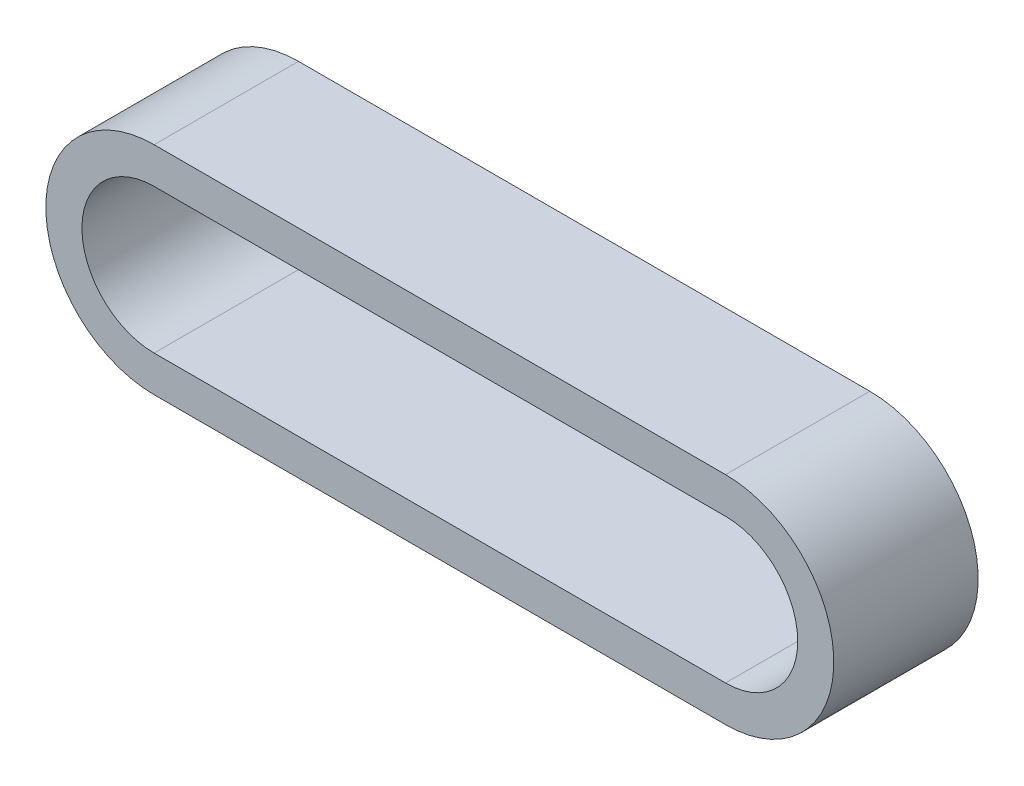
ISO-10303-21;
HEADER;
FILE_DESCRIPTION(('STEP AP214'),'2;1');
FILE_NAME('part.step','',(''),(''),'','','');
FILE_SCHEMA(('AUTOMOTIVE_DESIGN { 1 0 10303 214 1 1 1 1 }'));
ENDSEC;
DATA;
#1=APPLICATION_CONTEXT('core data for automotive mechanical design processes');
#2=APPLICATION_PROTOCOL_DEFINITION('international standard','automotive_design',2000,#1);
#3=PRODUCT_CONTEXT('',#1,'mechanical');
#4=PRODUCT('Part','Part','',(#3));
#5=PRODUCT_RELATED_PRODUCT_CATEGORY('part','',(#4));
#6=PRODUCT_DEFINITION_FORMATION('','',#4);
#7=PRODUCT_DEFINITION_CONTEXT('part definition',#1,'design');
#8=PRODUCT_DEFINITION('design','',#6,#7);
#9=PRODUCT_DEFINITION_SHAPE('','',#8);
#10=(LENGTH_UNIT() NAMED_UNIT(*) SI_UNIT(.MILLI.,.METRE.));
#11=(NAMED_UNIT(*) PLANE_ANGLE_UNIT() SI_UNIT($,.RADIAN.));
#12=(NAMED_UNIT(*) SI_UNIT($,.STERADIAN.) SOLID_ANGLE_UNIT());
#13=UNCERTAINTY_MEASURE_WITH_UNIT(LENGTH_MEASURE(1.E-05),#10,'distance_accuracy_value','');
#14=(GEOMETRIC_REPRESENTATION_CONTEXT(3) GLOBAL_UNCERTAINTY_ASSIGNED_CONTEXT((#13)) GLOBAL_UNIT_ASSIGNED_CONTEXT((#10,
#11,#12)) REPRESENTATION_CONTEXT('',''));
#15=CARTESIAN_POINT('',(0.,0.,0.));
#16=DIRECTION('',(0.,0.,1.));
#17=DIRECTION('',(1.,0.,0.));
#18=AXIS2_PLACEMENT_3D('',#15,#16,#17);
#19=CARTESIAN_POINT('',(0.,0.,6.));
#20=DIRECTION('',(0.,0.,1.));
#21=DIRECTION('',(1.,0.,0.));
#22=AXIS2_PLACEMENT_3D('',#19,#20,#21);
#23=PLANE('',#22);
#24=CARTESIAN_POINT('',(0.,0.,6.));
#25=DIRECTION('',(0.,0.,1.));
#26=DIRECTION('',(1.,0.,0.));
#27=AXIS2_PLACEMENT_3D('',#24,#25,#26);
#28=CIRCLE('',#27,4.5);
#29=CARTESIAN_POINT('',(0.,4.5,6.));
#30=VERTEX_POINT('',#29);
#31=CARTESIAN_POINT('',(0.,-4.5,6.));
#32=VERTEX_POINT('',#31);
#33=EDGE_CURVE('E138',#30,#32,#28,.T.);
#34=ORIENTED_EDGE('',*,*,#33,.T.);
#35=DIRECTION('',(1.,0.,0.));
#36=VECTOR('',#35,1.);
#37=CARTESIAN_POINT('',(0.,-4.5,6.));
#38=LINE('',#37,#36);
#39=CARTESIAN_POINT('',(23.75,-4.5,6.));
#40=VERTEX_POINT('',#39);
#41=EDGE_CURVE('E141',#32,#40,#38,.T.);
#42=ORIENTED_EDGE('',*,*,#41,.T.);
#43=CARTESIAN_POINT('',(23.75,0.,6.));
#44=DIRECTION('',(0.,0.,1.));
#45=DIRECTION('',(1.,0.,0.));
#46=AXIS2_PLACEMENT_3D('',#43,#44,#45);
#47=CIRCLE('',#46,4.5);
#48=CARTESIAN_POINT('',(23.75,4.5,6.));
#49=VERTEX_POINT('',#48);
#50=EDGE_CURVE('E144',#40,#49,#47,.T.);
#51=ORIENTED_EDGE('',*,*,#50,.T.);
#52=DIRECTION('',(-1.,0.,0.));
#53=VECTOR('',#52,1.);
#54=CARTESIAN_POINT('',(0.,4.5,6.));
#55=LINE('',#54,#53);
#56=EDGE_CURVE('E146',#49,#30,#55,.T.);
#57=ORIENTED_EDGE('',*,*,#56,.T.);
#58=EDGE_LOOP('',(#34,#42,#51,#57));
#59=FACE_BOUND('',#58,.T.);
#60=DIRECTION('',(1.,0.,0.));
#61=VECTOR('',#60,1.);
#62=CARTESIAN_POINT('',(0.,-3.,6.));
#63=LINE('',#62,#61);
#64=CARTESIAN_POINT('',(0.,-3.,6.));
#65=VERTEX_POINT('',#64);
#66=CARTESIAN_POINT('',(23.75,-3.,6.));
#67=VERTEX_POINT('',#66);
#68=EDGE_CURVE('E110',#65,#67,#63,.T.);
#69=ORIENTED_EDGE('',*,*,#68,.F.);
#70=CARTESIAN_POINT('',(0.,0.,6.));
#71=DIRECTION('',(0.,0.,1.));
#72=DIRECTION('',(1.,0.,0.));
#73=AXIS2_PLACEMENT_3D('',#70,#71,#72);
#74=CIRCLE('',#73,3.);
#75=CARTESIAN_POINT('',(0.,3.,6.));
#76=VERTEX_POINT('',#75);
#77=EDGE_CURVE('E102',#76,#65,#74,.T.);
#78=ORIENTED_EDGE('',*,*,#77,.F.);
#79=DIRECTION('',(-1.,0.,0.));
#80=VECTOR('',#79,1.);
#81=CARTESIAN_POINT('',(0.,3.,6.));
#82=LINE('',#81,#80);
#83=CARTESIAN_POINT('',(23.75,3.,6.));
#84=VERTEX_POINT('',#83);
#85=EDGE_CURVE('E124',#84,#76,#82,.T.);
#86=ORIENTED_EDGE('',*,*,#85,.F.);
#87=CARTESIAN_POINT('',(23.75,0.,6.));
#88=DIRECTION('',(0.,0.,1.));
#89=DIRECTION('',(1.,0.,0.));
#90=AXIS2_PLACEMENT_3D('',#87,#88,#89);
#91=CIRCLE('',#90,3.);
#92=EDGE_CURVE('E122',#67,#84,#91,.T.);
#93=ORIENTED_EDGE('',*,*,#92,.F.);
#94=EDGE_LOOP('',(#69,#78,#86,#93));
#95=FACE_BOUND('',#94,.T.);
#96=ADVANCED_FACE('F37',(#59,#95),#23,.T.);
#97=CARTESIAN_POINT('',(0.,0.,0.));
#98=DIRECTION('',(0.,0.,1.));
#99=DIRECTION('',(1.,0.,0.));
#100=AXIS2_PLACEMENT_3D('',#97,#98,#99);
#101=PLANE('',#100);
#102=CARTESIAN_POINT('',(0.,0.,0.));
#103=DIRECTION('',(0.,0.,1.));
#104=DIRECTION('',(1.,0.,0.));
#105=AXIS2_PLACEMENT_3D('',#102,#103,#104);
#106=CIRCLE('',#105,4.5);
#107=CARTESIAN_POINT('',(0.,4.5,0.));
#108=VERTEX_POINT('',#107);
#109=CARTESIAN_POINT('',(0.,-4.5,0.));
#110=VERTEX_POINT('',#109);
#111=EDGE_CURVE('E118',#108,#110,#106,.T.);
#112=ORIENTED_EDGE('',*,*,#111,.F.);
#113=DIRECTION('',(-1.,0.,0.));
#114=VECTOR('',#113,1.);
#115=CARTESIAN_POINT('',(0.,4.5,0.));
#116=LINE('',#115,#114);
#117=CARTESIAN_POINT('',(23.75,4.5,0.));
#118=VERTEX_POINT('',#117);
#119=EDGE_CURVE('E142',#118,#108,#116,.T.);
#120=ORIENTED_EDGE('',*,*,#119,.F.);
#121=CARTESIAN_POINT('',(23.75,0.,0.));
#122=DIRECTION('',(0.,0.,1.));
#123=DIRECTION('',(1.,0.,0.));
#124=AXIS2_PLACEMENT_3D('',#121,#122,#123);
#125=CIRCLE('',#124,4.5);
#126=CARTESIAN_POINT('',(23.75,-4.5,0.));
#127=VERTEX_POINT('',#126);
#128=EDGE_CURVE('E153',#127,#118,#125,.T.);
#129=ORIENTED_EDGE('',*,*,#128,.F.);
#130=DIRECTION('',(1.,0.,0.));
#131=VECTOR('',#130,1.);
#132=CARTESIAN_POINT('',(0.,-4.5,0.));
#133=LINE('',#132,#131);
#134=EDGE_CURVE('E151',#110,#127,#133,.T.);
#135=ORIENTED_EDGE('',*,*,#134,.F.);
#136=EDGE_LOOP('',(#112,#120,#129,#135));
#137=FACE_BOUND('',#136,.T.);
#138=CARTESIAN_POINT('',(0.,0.,0.));
#139=DIRECTION('',(0.,0.,1.));
#140=DIRECTION('',(1.,0.,0.));
#141=AXIS2_PLACEMENT_3D('',#138,#139,#140);
#142=CIRCLE('',#141,3.);
#143=CARTESIAN_POINT('',(0.,3.,0.));
#144=VERTEX_POINT('',#143);
#145=CARTESIAN_POINT('',(0.,-3.,0.));
#146=VERTEX_POINT('',#145);
#147=EDGE_CURVE('E60',#144,#146,#142,.T.);
#148=ORIENTED_EDGE('',*,*,#147,.T.);
#149=DIRECTION('',(1.,0.,0.));
#150=VECTOR('',#149,1.);
#151=CARTESIAN_POINT('',(0.,-3.,0.));
#152=LINE('',#151,#150);
#153=CARTESIAN_POINT('',(23.75,-3.,0.));
#154=VERTEX_POINT('',#153);
#155=EDGE_CURVE('E117',#146,#154,#152,.T.);
#156=ORIENTED_EDGE('',*,*,#155,.T.);
#157=CARTESIAN_POINT('',(23.75,0.,0.));
#158=DIRECTION('',(0.,0.,1.));
#159=DIRECTION('',(1.,0.,0.));
#160=AXIS2_PLACEMENT_3D('',#157,#158,#159);
#161=CIRCLE('',#160,3.);
#162=CARTESIAN_POINT('',(23.75,3.,0.));
#163=VERTEX_POINT('',#162);
#164=EDGE_CURVE('E130',#154,#163,#161,.T.);
#165=ORIENTED_EDGE('',*,*,#164,.T.);
#166=DIRECTION('',(-1.,0.,0.));
#167=VECTOR('',#166,1.);
#168=CARTESIAN_POINT('',(0.,3.,0.));
#169=LINE('',#168,#167);
#170=EDGE_CURVE('E111',#163,#144,#169,.T.);
#171=ORIENTED_EDGE('',*,*,#170,.T.);
#172=EDGE_LOOP('',(#148,#156,#165,#171));
#173=FACE_BOUND('',#172,.T.);
#174=ADVANCED_FACE('F171',(#137,#173),#101,.F.);
#175=CARTESIAN_POINT('',(0.,0.,6.));
#176=DIRECTION('',(0.,0.,-1.));
#177=DIRECTION('',(-1.,0.,0.));
#178=AXIS2_PLACEMENT_3D('',#175,#176,#177);
#179=CYLINDRICAL_SURFACE('',#178,4.5);
#180=ORIENTED_EDGE('',*,*,#111,.T.);
#181=DIRECTION('',(0.,0.,-1.));
#182=VECTOR('',#181,1.);
#183=CARTESIAN_POINT('',(0.,-4.5,6.));
#184=LINE('',#183,#182);
#185=EDGE_CURVE('E11',#32,#110,#184,.T.);
#186=ORIENTED_EDGE('',*,*,#185,.F.);
#187=ORIENTED_EDGE('',*,*,#33,.F.);
#188=DIRECTION('',(0.,0.,-1.));
#189=VECTOR('',#188,1.);
#190=CARTESIAN_POINT('',(0.,4.5,6.));
#191=LINE('',#190,#189);
#192=EDGE_CURVE('E148',#30,#108,#191,.T.);
#193=ORIENTED_EDGE('',*,*,#192,.T.);
#194=EDGE_LOOP('',(#180,#186,#187,#193));
#195=FACE_BOUND('',#194,.T.);
#196=ADVANCED_FACE('F39',(#195),#179,.T.);
#197=CARTESIAN_POINT('',(0.,-4.5,6.));
#198=DIRECTION('',(0.,1.,0.));
#199=DIRECTION('',(0.,0.,1.));
#200=AXIS2_PLACEMENT_3D('',#197,#198,#199);
#201=PLANE('',#200);
#202=ORIENTED_EDGE('',*,*,#134,.T.);
#203=DIRECTION('',(0.,0.,-1.));
#204=VECTOR('',#203,1.);
#205=CARTESIAN_POINT('',(23.75,-4.5,6.));
#206=LINE('',#205,#204);
#207=EDGE_CURVE('E45',#40,#127,#206,.T.);
#208=ORIENTED_EDGE('',*,*,#207,.F.);
#209=ORIENTED_EDGE('',*,*,#41,.F.);
#210=ORIENTED_EDGE('',*,*,#185,.T.);
#211=EDGE_LOOP('',(#202,#208,#209,#210));
#212=FACE_BOUND('',#211,.T.);
#213=ADVANCED_FACE('F181',(#212),#201,.F.);
#214=CARTESIAN_POINT('',(23.75,0.,6.));
#215=DIRECTION('',(0.,0.,-1.));
#216=DIRECTION('',(-1.,0.,0.));
#217=AXIS2_PLACEMENT_3D('',#214,#215,#216);
#218=CYLINDRICAL_SURFACE('',#217,4.5);
#219=ORIENTED_EDGE('',*,*,#128,.T.);
#220=DIRECTION('',(0.,0.,-1.));
#221=VECTOR('',#220,1.);
#222=CARTESIAN_POINT('',(23.75,4.5,6.));
#223=LINE('',#222,#221);
#224=EDGE_CURVE('E158',#49,#118,#223,.T.);
#225=ORIENTED_EDGE('',*,*,#224,.F.);
#226=ORIENTED_EDGE('',*,*,#50,.F.);
#227=ORIENTED_EDGE('',*,*,#207,.T.);
#228=EDGE_LOOP('',(#219,#225,#226,#227));
#229=FACE_BOUND('',#228,.T.);
#230=ADVANCED_FACE('F165',(#229),#218,.T.);
#231=CARTESIAN_POINT('',(0.,4.5,6.));
#232=DIRECTION('',(0.,-1.,0.));
#233=DIRECTION('',(0.,0.,-1.));
#234=AXIS2_PLACEMENT_3D('',#231,#232,#233);
#235=PLANE('',#234);
#236=ORIENTED_EDGE('',*,*,#119,.T.);
#237=ORIENTED_EDGE('',*,*,#192,.F.);
#238=ORIENTED_EDGE('',*,*,#56,.F.);
#239=ORIENTED_EDGE('',*,*,#224,.T.);
#240=EDGE_LOOP('',(#236,#237,#238,#239));
#241=FACE_BOUND('',#240,.T.);
#242=ADVANCED_FACE('F175',(#241),#235,.F.);
#243=CARTESIAN_POINT('',(0.,0.,6.));
#244=DIRECTION('',(0.,0.,-1.));
#245=DIRECTION('',(-1.,0.,0.));
#246=AXIS2_PLACEMENT_3D('',#243,#244,#245);
#247=CYLINDRICAL_SURFACE('',#246,3.);
#248=ORIENTED_EDGE('',*,*,#147,.F.);
#249=DIRECTION('',(0.,0.,-1.));
#250=VECTOR('',#249,1.);
#251=CARTESIAN_POINT('',(0.,3.,6.));
#252=LINE('',#251,#250);
#253=EDGE_CURVE('E106',#76,#144,#252,.T.);
#254=ORIENTED_EDGE('',*,*,#253,.F.);
#255=ORIENTED_EDGE('',*,*,#77,.T.);
#256=DIRECTION('',(0.,0.,-1.));
#257=VECTOR('',#256,1.);
#258=CARTESIAN_POINT('',(0.,-3.,6.));
#259=LINE('',#258,#257);
#260=EDGE_CURVE('E105',#65,#146,#259,.T.);
#261=ORIENTED_EDGE('',*,*,#260,.T.);
#262=EDGE_LOOP('',(#248,#254,#255,#261));
#263=FACE_BOUND('',#262,.T.);
#264=ADVANCED_FACE('F104',(#263),#247,.F.);
#265=CARTESIAN_POINT('',(0.,-3.,6.));
#266=DIRECTION('',(0.,1.,0.));
#267=DIRECTION('',(0.,0.,1.));
#268=AXIS2_PLACEMENT_3D('',#265,#266,#267);
#269=PLANE('',#268);
#270=ORIENTED_EDGE('',*,*,#155,.F.);
#271=ORIENTED_EDGE('',*,*,#260,.F.);
#272=ORIENTED_EDGE('',*,*,#68,.T.);
#273=DIRECTION('',(0.,0.,-1.));
#274=VECTOR('',#273,1.);
#275=CARTESIAN_POINT('',(23.75,-3.,6.));
#276=LINE('',#275,#274);
#277=EDGE_CURVE('E119',#67,#154,#276,.T.);
#278=ORIENTED_EDGE('',*,*,#277,.T.);
#279=EDGE_LOOP('',(#270,#271,#272,#278));
#280=FACE_BOUND('',#279,.T.);
#281=ADVANCED_FACE('F114',(#280),#269,.T.);
#282=CARTESIAN_POINT('',(23.75,0.,6.));
#283=DIRECTION('',(0.,0.,-1.));
#284=DIRECTION('',(-1.,0.,0.));
#285=AXIS2_PLACEMENT_3D('',#282,#283,#284);
#286=CYLINDRICAL_SURFACE('',#285,3.);
#287=ORIENTED_EDGE('',*,*,#164,.F.);
#288=ORIENTED_EDGE('',*,*,#277,.F.);
#289=ORIENTED_EDGE('',*,*,#92,.T.);
#290=DIRECTION('',(0.,0.,-1.));
#291=VECTOR('',#290,1.);
#292=CARTESIAN_POINT('',(23.75,3.,6.));
#293=LINE('',#292,#291);
#294=EDGE_CURVE('E52',#84,#163,#293,.T.);
#295=ORIENTED_EDGE('',*,*,#294,.T.);
#296=EDGE_LOOP('',(#287,#288,#289,#295));
#297=FACE_BOUND('',#296,.T.);
#298=ADVANCED_FACE('F204',(#297),#286,.F.);
#299=CARTESIAN_POINT('',(0.,3.,6.));
#300=DIRECTION('',(0.,-1.,0.));
#301=DIRECTION('',(0.,0.,-1.));
#302=AXIS2_PLACEMENT_3D('',#299,#300,#301);
#303=PLANE('',#302);
#304=ORIENTED_EDGE('',*,*,#170,.F.);
#305=ORIENTED_EDGE('',*,*,#294,.F.);
#306=ORIENTED_EDGE('',*,*,#85,.T.);
#307=ORIENTED_EDGE('',*,*,#253,.T.);
#308=EDGE_LOOP('',(#304,#305,#306,#307));
#309=FACE_BOUND('',#308,.T.);
#310=ADVANCED_FACE('F208',(#309),#303,.T.);
#311=CLOSED_SHELL('',(#96,#174,#196,#213,#230,#242,#264,#281,#298,#310));
#312=MANIFOLD_SOLID_BREP('B2',#311);
#313=ADVANCED_BREP_SHAPE_REPRESENTATION('',(#18,#312),#14);
#314=SHAPE_DEFINITION_REPRESENTATION(#9,#313);
ENDSEC;
END-ISO-10303-21;
